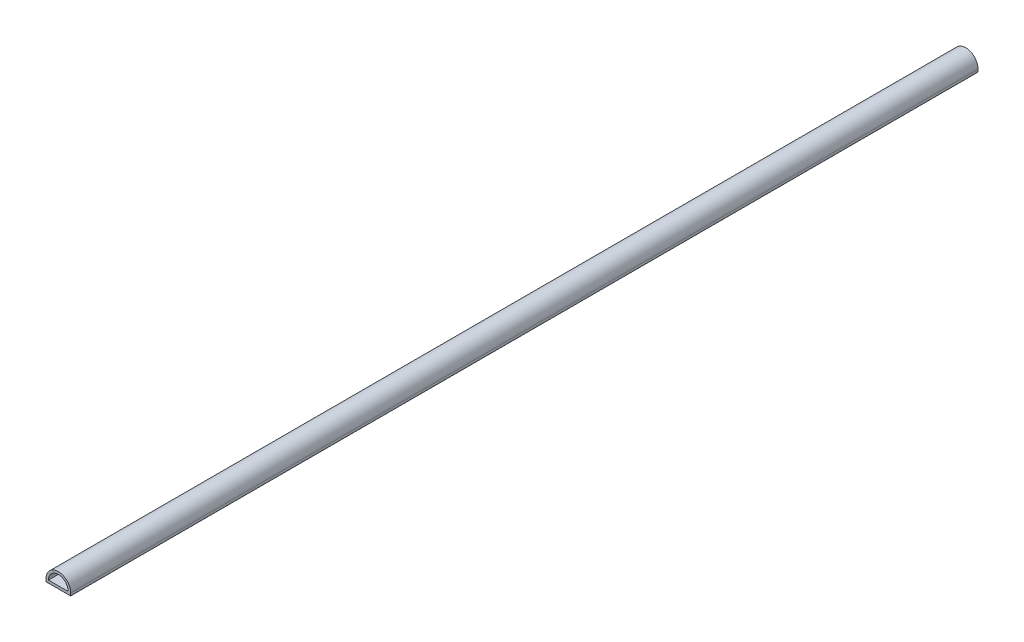
ISO-10303-21;
HEADER;
FILE_DESCRIPTION(('STEP AP214'),'2;1');
FILE_NAME('part.step','',(''),(''),'','','');
FILE_SCHEMA(('AUTOMOTIVE_DESIGN { 1 0 10303 214 1 1 1 1 }'));
ENDSEC;
DATA;
#1=APPLICATION_CONTEXT('core data for automotive mechanical design processes');
#2=APPLICATION_PROTOCOL_DEFINITION('international standard','automotive_design',2000,#1);
#3=PRODUCT_CONTEXT('',#1,'mechanical');
#4=PRODUCT('Part','Part','',(#3));
#5=PRODUCT_RELATED_PRODUCT_CATEGORY('part','',(#4));
#6=PRODUCT_DEFINITION_FORMATION('','',#4);
#7=PRODUCT_DEFINITION_CONTEXT('part definition',#1,'design');
#8=PRODUCT_DEFINITION('design','',#6,#7);
#9=PRODUCT_DEFINITION_SHAPE('','',#8);
#10=(LENGTH_UNIT() NAMED_UNIT(*) SI_UNIT(.MILLI.,.METRE.));
#11=(NAMED_UNIT(*) PLANE_ANGLE_UNIT() SI_UNIT($,.RADIAN.));
#12=(NAMED_UNIT(*) SI_UNIT($,.STERADIAN.) SOLID_ANGLE_UNIT());
#13=UNCERTAINTY_MEASURE_WITH_UNIT(LENGTH_MEASURE(1.E-05),#10,'distance_accuracy_value','');
#14=(GEOMETRIC_REPRESENTATION_CONTEXT(3) GLOBAL_UNCERTAINTY_ASSIGNED_CONTEXT((#13)) GLOBAL_UNIT_ASSIGNED_CONTEXT((#10,
#11,#12)) REPRESENTATION_CONTEXT('',''));
#15=CARTESIAN_POINT('',(0.,0.,0.));
#16=DIRECTION('',(0.,0.,1.));
#17=DIRECTION('',(1.,0.,0.));
#18=AXIS2_PLACEMENT_3D('',#15,#16,#17);
#19=CARTESIAN_POINT('',(0.,-1.5875,0.));
#20=DIRECTION('',(0.,-1.,0.));
#21=DIRECTION('',(0.,0.,-1.));
#22=AXIS2_PLACEMENT_3D('',#19,#20,#21);
#23=PLANE('',#22);
#24=DIRECTION('',(-1.,0.,0.));
#25=VECTOR('',#24,1.);
#26=CARTESIAN_POINT('',(7.9375,-1.5875,432.4));
#27=LINE('',#26,#25);
#28=CARTESIAN_POINT('',(7.9375,-1.5875,432.4));
#29=VERTEX_POINT('',#28);
#30=CARTESIAN_POINT('',(-7.9375,-1.5875,432.4));
#31=VERTEX_POINT('',#30);
#32=EDGE_CURVE('P0_E84',#29,#31,#27,.T.);
#33=ORIENTED_EDGE('',*,*,#32,.F.);
#34=DIRECTION('',(0.,0.,1.));
#35=VECTOR('',#34,1.);
#36=CARTESIAN_POINT('',(7.9375,-1.5875,-152.4));
#37=LINE('',#36,#35);
#38=CARTESIAN_POINT('',(7.9375,-1.5875,-152.4));
#39=VERTEX_POINT('',#38);
#40=EDGE_CURVE('P0_E26',#39,#29,#37,.T.);
#41=ORIENTED_EDGE('',*,*,#40,.F.);
#42=DIRECTION('',(1.,0.,0.));
#43=VECTOR('',#42,1.);
#44=CARTESIAN_POINT('',(-7.9375,-1.5875,-152.4));
#45=LINE('',#44,#43);
#46=CARTESIAN_POINT('',(-7.9375,-1.5875,-152.4));
#47=VERTEX_POINT('',#46);
#48=EDGE_CURVE('P0_E112',#47,#39,#45,.T.);
#49=ORIENTED_EDGE('',*,*,#48,.F.);
#50=DIRECTION('',(0.,0.,-1.));
#51=VECTOR('',#50,1.);
#52=CARTESIAN_POINT('',(-7.9375,-1.5875,152.4));
#53=LINE('',#52,#51);
#54=EDGE_CURVE('P0_E88',#31,#47,#53,.T.);
#55=ORIENTED_EDGE('',*,*,#54,.F.);
#56=EDGE_LOOP('',(#33,#41,#49,#55));
#57=FACE_BOUND('',#56,.T.);
#58=ADVANCED_FACE('P0_F16',(#57),#23,.F.);
#59=CARTESIAN_POINT('',(0.,-1.7145,0.));
#60=DIRECTION('',(0.,-1.,0.));
#61=DIRECTION('',(0.,0.,-1.));
#62=AXIS2_PLACEMENT_3D('',#59,#60,#61);
#63=PLANE('',#62);
#64=DIRECTION('',(-1.,0.,0.));
#65=VECTOR('',#64,1.);
#66=CARTESIAN_POINT('',(7.9375,-1.7145,432.4));
#67=LINE('',#66,#65);
#68=CARTESIAN_POINT('',(7.9375,-1.7145,432.4));
#69=VERTEX_POINT('',#68);
#70=CARTESIAN_POINT('',(-7.9375,-1.7145,432.4));
#71=VERTEX_POINT('',#70);
#72=EDGE_CURVE('P0_E86',#69,#71,#67,.T.);
#73=ORIENTED_EDGE('',*,*,#72,.T.);
#74=DIRECTION('',(0.,0.,-1.));
#75=VECTOR('',#74,1.);
#76=CARTESIAN_POINT('',(-7.9375,-1.7145,152.4));
#77=LINE('',#76,#75);
#78=CARTESIAN_POINT('',(-7.9375,-1.7145,-152.4));
#79=VERTEX_POINT('',#78);
#80=EDGE_CURVE('P0_E105',#71,#79,#77,.T.);
#81=ORIENTED_EDGE('',*,*,#80,.T.);
#82=DIRECTION('',(1.,0.,0.));
#83=VECTOR('',#82,1.);
#84=CARTESIAN_POINT('',(-7.9375,-1.7145,-152.4));
#85=LINE('',#84,#83);
#86=CARTESIAN_POINT('',(7.9375,-1.7145,-152.4));
#87=VERTEX_POINT('',#86);
#88=EDGE_CURVE('P0_E20',#79,#87,#85,.T.);
#89=ORIENTED_EDGE('',*,*,#88,.T.);
#90=DIRECTION('',(0.,0.,1.));
#91=VECTOR('',#90,1.);
#92=CARTESIAN_POINT('',(7.9375,-1.7145,-152.4));
#93=LINE('',#92,#91);
#94=EDGE_CURVE('P0_E11',#87,#69,#93,.T.);
#95=ORIENTED_EDGE('',*,*,#94,.T.);
#96=EDGE_LOOP('',(#73,#81,#89,#95));
#97=FACE_BOUND('',#96,.T.);
#98=ADVANCED_FACE('P0_F18',(#97),#63,.T.);
#99=CARTESIAN_POINT('',(7.9375,-1.7145,-152.4));
#100=DIRECTION('',(-1.,0.,0.));
#101=DIRECTION('',(0.,0.,1.));
#102=AXIS2_PLACEMENT_3D('',#99,#100,#101);
#103=PLANE('',#102);
#104=ORIENTED_EDGE('',*,*,#40,.T.);
#105=DIRECTION('',(0.,1.,0.));
#106=VECTOR('',#105,1.);
#107=CARTESIAN_POINT('',(7.9375,-1.7145,432.4));
#108=LINE('',#107,#106);
#109=EDGE_CURVE('P0_E73',#69,#29,#108,.T.);
#110=ORIENTED_EDGE('',*,*,#109,.F.);
#111=ORIENTED_EDGE('',*,*,#94,.F.);
#112=DIRECTION('',(0.,1.,0.));
#113=VECTOR('',#112,1.);
#114=CARTESIAN_POINT('',(7.9375,-1.7145,-152.4));
#115=LINE('',#114,#113);
#116=EDGE_CURVE('P0_E76',#87,#39,#115,.T.);
#117=ORIENTED_EDGE('',*,*,#116,.T.);
#118=EDGE_LOOP('',(#104,#110,#111,#117));
#119=FACE_BOUND('',#118,.T.);
#120=ADVANCED_FACE('P0_F72',(#119),#103,.F.);
#121=CARTESIAN_POINT('',(-7.9375,-1.7145,-152.4));
#122=DIRECTION('',(0.,0.,1.));
#123=DIRECTION('',(1.,0.,0.));
#124=AXIS2_PLACEMENT_3D('',#121,#122,#123);
#125=PLANE('',#124);
#126=ORIENTED_EDGE('',*,*,#48,.T.);
#127=ORIENTED_EDGE('',*,*,#116,.F.);
#128=ORIENTED_EDGE('',*,*,#88,.F.);
#129=DIRECTION('',(0.,1.,0.));
#130=VECTOR('',#129,1.);
#131=CARTESIAN_POINT('',(-7.9375,-1.7145,-152.4));
#132=LINE('',#131,#130);
#133=EDGE_CURVE('P0_E101',#79,#47,#132,.T.);
#134=ORIENTED_EDGE('',*,*,#133,.T.);
#135=EDGE_LOOP('',(#126,#127,#128,#134));
#136=FACE_BOUND('',#135,.T.);
#137=ADVANCED_FACE('P0_F119',(#136),#125,.F.);
#138=CARTESIAN_POINT('',(-7.9375,-1.7145,152.4));
#139=DIRECTION('',(1.,0.,0.));
#140=DIRECTION('',(0.,1.,0.));
#141=AXIS2_PLACEMENT_3D('',#138,#139,#140);
#142=PLANE('',#141);
#143=ORIENTED_EDGE('',*,*,#54,.T.);
#144=ORIENTED_EDGE('',*,*,#133,.F.);
#145=ORIENTED_EDGE('',*,*,#80,.F.);
#146=DIRECTION('',(0.,1.,0.));
#147=VECTOR('',#146,1.);
#148=CARTESIAN_POINT('',(-7.9375,-1.7145,432.4));
#149=LINE('',#148,#147);
#150=EDGE_CURVE('P0_E93',#71,#31,#149,.T.);
#151=ORIENTED_EDGE('',*,*,#150,.T.);
#152=EDGE_LOOP('',(#143,#144,#145,#151));
#153=FACE_BOUND('',#152,.T.);
#154=ADVANCED_FACE('P0_F122',(#153),#142,.F.);
#155=CARTESIAN_POINT('',(7.9375,-1.7145,432.4));
#156=DIRECTION('',(0.,0.,-1.));
#157=DIRECTION('',(0.,-1.,0.));
#158=AXIS2_PLACEMENT_3D('',#155,#156,#157);
#159=PLANE('',#158);
#160=ORIENTED_EDGE('',*,*,#32,.T.);
#161=ORIENTED_EDGE('',*,*,#150,.F.);
#162=ORIENTED_EDGE('',*,*,#72,.F.);
#163=ORIENTED_EDGE('',*,*,#109,.T.);
#164=EDGE_LOOP('',(#160,#161,#162,#163));
#165=FACE_BOUND('',#164,.T.);
#166=ADVANCED_FACE('P0_F82',(#165),#159,.F.);
#167=CLOSED_SHELL('',(#58,#98,#120,#137,#154,#166));
#168=MANIFOLD_SOLID_BREP('P0_B1',#167);
#169=CARTESIAN_POINT('',(-6.35,0.,-152.4));
#170=DIRECTION('',(0.,-1.,0.));
#171=DIRECTION('',(-1.,0.,0.));
#172=AXIS2_PLACEMENT_3D('',#169,#170,#171);
#173=PLANE('',#172);
#174=DIRECTION('',(0.,0.,1.));
#175=VECTOR('',#174,1.);
#176=CARTESIAN_POINT('',(6.35,0.,-152.4));
#177=LINE('',#176,#175);
#178=CARTESIAN_POINT('',(6.35,0.,-152.4));
#179=VERTEX_POINT('',#178);
#180=CARTESIAN_POINT('',(6.35,0.,432.4));
#181=VERTEX_POINT('',#180);
#182=EDGE_CURVE('P1_E11',#179,#181,#177,.T.);
#183=ORIENTED_EDGE('',*,*,#182,.F.);
#184=DIRECTION('',(1.,0.,0.));
#185=VECTOR('',#184,1.);
#186=CARTESIAN_POINT('',(-6.35,0.,-152.4));
#187=LINE('',#186,#185);
#188=CARTESIAN_POINT('',(-6.35,0.,-152.4));
#189=VERTEX_POINT('',#188);
#190=EDGE_CURVE('P1_E131',#189,#179,#187,.T.);
#191=ORIENTED_EDGE('',*,*,#190,.F.);
#192=DIRECTION('',(0.,0.,1.));
#193=VECTOR('',#192,1.);
#194=CARTESIAN_POINT('',(-6.35,0.,-152.4));
#195=LINE('',#194,#193);
#196=CARTESIAN_POINT('',(-6.35,0.,432.4));
#197=VERTEX_POINT('',#196);
#198=EDGE_CURVE('P1_E26',#189,#197,#195,.T.);
#199=ORIENTED_EDGE('',*,*,#198,.T.);
#200=DIRECTION('',(1.,0.,0.));
#201=VECTOR('',#200,1.);
#202=CARTESIAN_POINT('',(-6.35,0.,432.4));
#203=LINE('',#202,#201);
#204=EDGE_CURVE('P1_E128',#197,#181,#203,.T.);
#205=ORIENTED_EDGE('',*,*,#204,.T.);
#206=EDGE_LOOP('',(#183,#191,#199,#205));
#207=FACE_BOUND('',#206,.T.);
#208=ADVANCED_FACE('P1_F17',(#207),#173,.F.);
#209=CARTESIAN_POINT('',(0.,0.,-152.4));
#210=DIRECTION('',(0.,0.,1.));
#211=DIRECTION('',(1.,0.,0.));
#212=AXIS2_PLACEMENT_3D('',#209,#210,#211);
#213=CYLINDRICAL_SURFACE('',#212,6.35);
#214=ORIENTED_EDGE('',*,*,#198,.F.);
#215=CARTESIAN_POINT('',(0.,0.,-152.4));
#216=DIRECTION('',(0.,0.,1.));
#217=DIRECTION('',(1.,0.,0.));
#218=AXIS2_PLACEMENT_3D('',#215,#216,#217);
#219=CIRCLE('',#218,6.35);
#220=EDGE_CURVE('P1_E136',#179,#189,#219,.T.);
#221=ORIENTED_EDGE('',*,*,#220,.F.);
#222=ORIENTED_EDGE('',*,*,#182,.T.);
#223=CARTESIAN_POINT('',(0.,0.,432.4));
#224=DIRECTION('',(0.,0.,1.));
#225=DIRECTION('',(1.,0.,0.));
#226=AXIS2_PLACEMENT_3D('',#223,#224,#225);
#227=CIRCLE('',#226,6.35);
#228=EDGE_CURVE('P1_E132',#181,#197,#227,.T.);
#229=ORIENTED_EDGE('',*,*,#228,.T.);
#230=EDGE_LOOP('',(#214,#221,#222,#229));
#231=FACE_BOUND('',#230,.T.);
#232=ADVANCED_FACE('P1_F298',(#231),#213,.F.);
#233=CARTESIAN_POINT('',(0.,0.,-152.4));
#234=DIRECTION('',(0.,0.,1.));
#235=DIRECTION('',(1.,0.,0.));
#236=AXIS2_PLACEMENT_3D('',#233,#234,#235);
#237=PLANE('',#236);
#238=ORIENTED_EDGE('',*,*,#190,.T.);
#239=ORIENTED_EDGE('',*,*,#220,.T.);
#240=EDGE_LOOP('',(#238,#239));
#241=FACE_BOUND('',#240,.T.);
#242=DIRECTION('',(0.,-1.,0.));
#243=VECTOR('',#242,1.);
#244=CARTESIAN_POINT('',(-7.9375,0.,-152.4));
#245=LINE('',#244,#243);
#246=CARTESIAN_POINT('',(-7.9375,0.,-152.4));
#247=VERTEX_POINT('',#246);
#248=CARTESIAN_POINT('',(-7.9375,-1.5875,-152.4));
#249=VERTEX_POINT('',#248);
#250=EDGE_CURVE('P1_E103',#247,#249,#245,.T.);
#251=ORIENTED_EDGE('',*,*,#250,.F.);
#252=CARTESIAN_POINT('',(0.,0.,-152.4));
#253=DIRECTION('',(0.,0.,1.));
#254=DIRECTION('',(1.,0.,0.));
#255=AXIS2_PLACEMENT_3D('',#252,#253,#254);
#256=CIRCLE('',#255,7.9375);
#257=CARTESIAN_POINT('',(7.9375,0.,-152.4));
#258=VERTEX_POINT('',#257);
#259=EDGE_CURVE('P1_E97',#258,#247,#256,.T.);
#260=ORIENTED_EDGE('',*,*,#259,.F.);
#261=DIRECTION('',(0.,1.,0.));
#262=VECTOR('',#261,1.);
#263=CARTESIAN_POINT('',(7.9375,0.,-152.4));
#264=LINE('',#263,#262);
#265=CARTESIAN_POINT('',(7.9375,-1.5875,-152.4));
#266=VERTEX_POINT('',#265);
#267=EDGE_CURVE('P1_E101',#266,#258,#264,.T.);
#268=ORIENTED_EDGE('',*,*,#267,.F.);
#269=DIRECTION('',(1.,0.,0.));
#270=VECTOR('',#269,1.);
#271=CARTESIAN_POINT('',(-7.9375,-1.5875,-152.4));
#272=LINE('',#271,#270);
#273=EDGE_CURVE('P1_E204',#249,#266,#272,.T.);
#274=ORIENTED_EDGE('',*,*,#273,.F.);
#275=EDGE_LOOP('',(#251,#260,#268,#274));
#276=FACE_BOUND('',#275,.T.);
#277=ADVANCED_FACE('P1_F99',(#241,#276),#237,.F.);
#278=CARTESIAN_POINT('',(0.,0.,432.4));
#279=DIRECTION('',(0.,0.,1.));
#280=DIRECTION('',(1.,0.,0.));
#281=AXIS2_PLACEMENT_3D('',#278,#279,#280);
#282=PLANE('',#281);
#283=ORIENTED_EDGE('',*,*,#228,.F.);
#284=ORIENTED_EDGE('',*,*,#204,.F.);
#285=EDGE_LOOP('',(#283,#284));
#286=FACE_BOUND('',#285,.T.);
#287=DIRECTION('',(0.,-1.,0.));
#288=VECTOR('',#287,1.);
#289=CARTESIAN_POINT('',(-7.9375,0.,432.4));
#290=LINE('',#289,#288);
#291=CARTESIAN_POINT('',(-7.9375,0.,432.4));
#292=VERTEX_POINT('',#291);
#293=CARTESIAN_POINT('',(-7.9375,-1.5875,432.4));
#294=VERTEX_POINT('',#293);
#295=EDGE_CURVE('P1_E200',#292,#294,#290,.T.);
#296=ORIENTED_EDGE('',*,*,#295,.T.);
#297=DIRECTION('',(1.,0.,0.));
#298=VECTOR('',#297,1.);
#299=CARTESIAN_POINT('',(-7.9375,-1.5875,432.4));
#300=LINE('',#299,#298);
#301=CARTESIAN_POINT('',(7.9375,-1.5875,432.4));
#302=VERTEX_POINT('',#301);
#303=EDGE_CURVE('P1_E119',#294,#302,#300,.T.);
#304=ORIENTED_EDGE('',*,*,#303,.T.);
#305=DIRECTION('',(0.,1.,0.));
#306=VECTOR('',#305,1.);
#307=CARTESIAN_POINT('',(7.9375,0.,432.4));
#308=LINE('',#307,#306);
#309=CARTESIAN_POINT('',(7.9375,0.,432.4));
#310=VERTEX_POINT('',#309);
#311=EDGE_CURVE('P1_E90',#302,#310,#308,.T.);
#312=ORIENTED_EDGE('',*,*,#311,.T.);
#313=CARTESIAN_POINT('',(0.,0.,432.4));
#314=DIRECTION('',(0.,0.,1.));
#315=DIRECTION('',(1.,0.,0.));
#316=AXIS2_PLACEMENT_3D('',#313,#314,#315);
#317=CIRCLE('',#316,7.9375);
#318=EDGE_CURVE('P1_E108',#310,#292,#317,.T.);
#319=ORIENTED_EDGE('',*,*,#318,.T.);
#320=EDGE_LOOP('',(#296,#304,#312,#319));
#321=FACE_BOUND('',#320,.T.);
#322=ADVANCED_FACE('P1_F282',(#286,#321),#282,.T.);
#323=CARTESIAN_POINT('',(0.,0.,152.4));
#324=DIRECTION('',(0.,0.,-1.));
#325=DIRECTION('',(-1.,0.,0.));
#326=AXIS2_PLACEMENT_3D('',#323,#324,#325);
#327=CYLINDRICAL_SURFACE('',#326,7.9375);
#328=DIRECTION('',(0.,0.,-1.));
#329=VECTOR('',#328,1.);
#330=CARTESIAN_POINT('',(7.9375,0.,152.4));
#331=LINE('',#330,#329);
#332=EDGE_CURVE('P1_E110',#310,#258,#331,.T.);
#333=ORIENTED_EDGE('',*,*,#332,.T.);
#334=ORIENTED_EDGE('',*,*,#259,.T.);
#335=DIRECTION('',(0.,0.,-1.));
#336=VECTOR('',#335,1.);
#337=CARTESIAN_POINT('',(-7.9375,0.,152.4));
#338=LINE('',#337,#336);
#339=EDGE_CURVE('P1_E217',#292,#247,#338,.T.);
#340=ORIENTED_EDGE('',*,*,#339,.F.);
#341=ORIENTED_EDGE('',*,*,#318,.F.);
#342=EDGE_LOOP('',(#333,#334,#340,#341));
#343=FACE_BOUND('',#342,.T.);
#344=ADVANCED_FACE('P1_F111',(#343),#327,.T.);
#345=CARTESIAN_POINT('',(7.9375,0.,152.4));
#346=DIRECTION('',(-1.,0.,0.));
#347=DIRECTION('',(0.,0.,1.));
#348=AXIS2_PLACEMENT_3D('',#345,#346,#347);
#349=PLANE('',#348);
#350=DIRECTION('',(0.,0.,-1.));
#351=VECTOR('',#350,1.);
#352=CARTESIAN_POINT('',(7.9375,-1.5875,152.4));
#353=LINE('',#352,#351);
#354=EDGE_CURVE('P1_E116',#302,#266,#353,.T.);
#355=ORIENTED_EDGE('',*,*,#354,.T.);
#356=ORIENTED_EDGE('',*,*,#267,.T.);
#357=ORIENTED_EDGE('',*,*,#332,.F.);
#358=ORIENTED_EDGE('',*,*,#311,.F.);
#359=EDGE_LOOP('',(#355,#356,#357,#358));
#360=FACE_BOUND('',#359,.T.);
#361=ADVANCED_FACE('P1_F114',(#360),#349,.F.);
#362=CARTESIAN_POINT('',(-7.9375,-1.5875,152.4));
#363=DIRECTION('',(0.,1.,0.));
#364=DIRECTION('',(1.,0.,0.));
#365=AXIS2_PLACEMENT_3D('',#362,#363,#364);
#366=PLANE('',#365);
#367=DIRECTION('',(0.,0.,-1.));
#368=VECTOR('',#367,1.);
#369=CARTESIAN_POINT('',(-7.9375,-1.5875,152.4));
#370=LINE('',#369,#368);
#371=EDGE_CURVE('P1_E196',#294,#249,#370,.T.);
#372=ORIENTED_EDGE('',*,*,#371,.T.);
#373=ORIENTED_EDGE('',*,*,#273,.T.);
#374=ORIENTED_EDGE('',*,*,#354,.F.);
#375=ORIENTED_EDGE('',*,*,#303,.F.);
#376=EDGE_LOOP('',(#372,#373,#374,#375));
#377=FACE_BOUND('',#376,.T.);
#378=ADVANCED_FACE('P1_F260',(#377),#366,.F.);
#379=CARTESIAN_POINT('',(-7.9375,0.,152.4));
#380=DIRECTION('',(1.,0.,0.));
#381=DIRECTION('',(0.,1.,0.));
#382=AXIS2_PLACEMENT_3D('',#379,#380,#381);
#383=PLANE('',#382);
#384=ORIENTED_EDGE('',*,*,#339,.T.);
#385=ORIENTED_EDGE('',*,*,#250,.T.);
#386=ORIENTED_EDGE('',*,*,#371,.F.);
#387=ORIENTED_EDGE('',*,*,#295,.F.);
#388=EDGE_LOOP('',(#384,#385,#386,#387));
#389=FACE_BOUND('',#388,.T.);
#390=ADVANCED_FACE('P1_F256',(#389),#383,.F.);
#391=CLOSED_SHELL('',(#208,#232,#277,#322,#344,#361,#378,#390));
#392=MANIFOLD_SOLID_BREP('P1_B1',#391);
#393=ADVANCED_BREP_SHAPE_REPRESENTATION('',(#18,#168,#392),#14);
#394=SHAPE_DEFINITION_REPRESENTATION(#9,#393);
ENDSEC;
END-ISO-10303-21;
